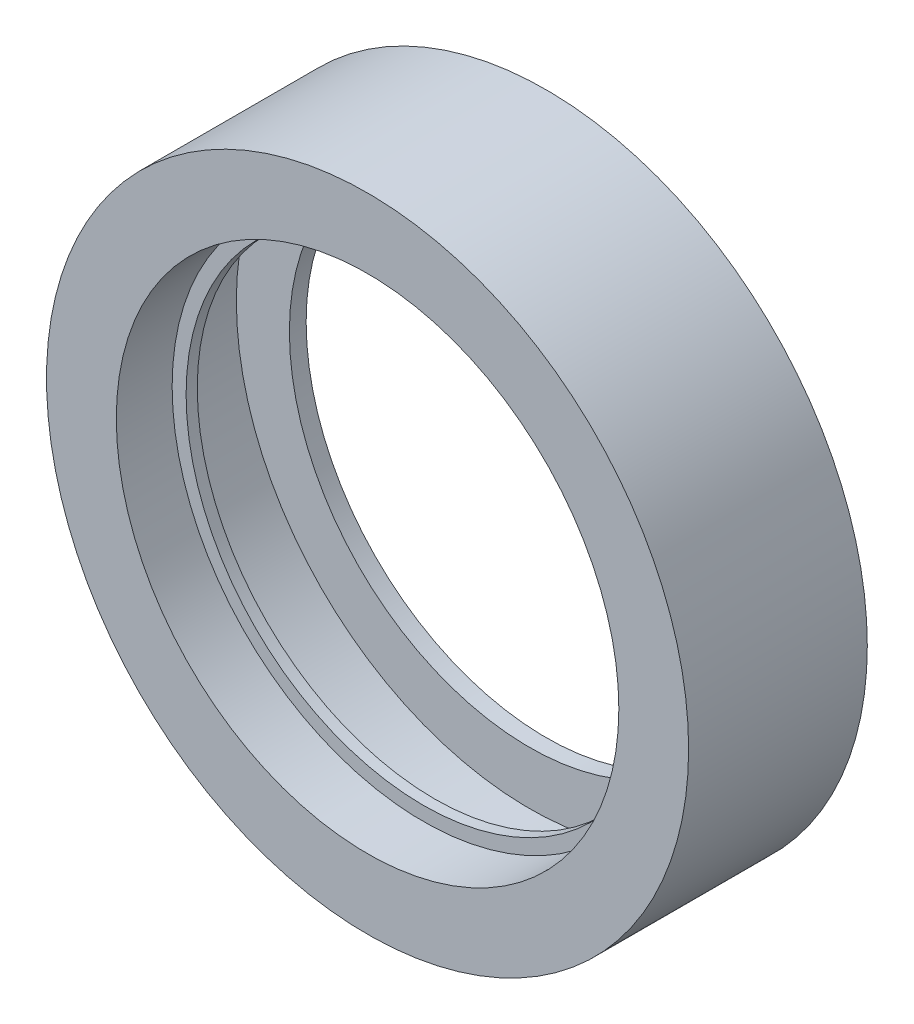
ISO-10303-21;
HEADER;
FILE_DESCRIPTION(('STEP AP214'),'2;1');
FILE_NAME('part.step','',(''),(''),'','','');
FILE_SCHEMA(('AUTOMOTIVE_DESIGN { 1 0 10303 214 1 1 1 1 }'));
ENDSEC;
DATA;
#1=APPLICATION_CONTEXT('core data for automotive mechanical design processes');
#2=APPLICATION_PROTOCOL_DEFINITION('international standard','automotive_design',2000,#1);
#3=PRODUCT_CONTEXT('',#1,'mechanical');
#4=PRODUCT('Part','Part','',(#3));
#5=PRODUCT_RELATED_PRODUCT_CATEGORY('part','',(#4));
#6=PRODUCT_DEFINITION_FORMATION('','',#4);
#7=PRODUCT_DEFINITION_CONTEXT('part definition',#1,'design');
#8=PRODUCT_DEFINITION('design','',#6,#7);
#9=PRODUCT_DEFINITION_SHAPE('','',#8);
#10=(LENGTH_UNIT() NAMED_UNIT(*) SI_UNIT(.MILLI.,.METRE.));
#11=(NAMED_UNIT(*) PLANE_ANGLE_UNIT() SI_UNIT($,.RADIAN.));
#12=(NAMED_UNIT(*) SI_UNIT($,.STERADIAN.) SOLID_ANGLE_UNIT());
#13=UNCERTAINTY_MEASURE_WITH_UNIT(LENGTH_MEASURE(1.E-05),#10,'distance_accuracy_value','');
#14=(GEOMETRIC_REPRESENTATION_CONTEXT(3) GLOBAL_UNCERTAINTY_ASSIGNED_CONTEXT((#13)) GLOBAL_UNIT_ASSIGNED_CONTEXT((#10,
#11,#12)) REPRESENTATION_CONTEXT('',''));
#15=CARTESIAN_POINT('',(0.,0.,0.));
#16=DIRECTION('',(0.,0.,1.));
#17=DIRECTION('',(1.,0.,0.));
#18=AXIS2_PLACEMENT_3D('',#15,#16,#17);
#19=CARTESIAN_POINT('',(0.,0.,32.));
#20=DIRECTION('',(0.,0.,-1.));
#21=DIRECTION('',(-1.,0.,0.));
#22=AXIS2_PLACEMENT_3D('',#19,#20,#21);
#23=CYLINDRICAL_SURFACE('',#22,52.5);
#24=CARTESIAN_POINT('',(0.,0.,20.));
#25=DIRECTION('',(0.,0.,1.));
#26=DIRECTION('',(1.,0.,0.));
#27=AXIS2_PLACEMENT_3D('',#24,#25,#26);
#28=CIRCLE('',#27,52.5);
#29=CARTESIAN_POINT('',(52.5,0.,20.));
#30=VERTEX_POINT('',#29);
#31=EDGE_CURVE('E58',#30,#30,#28,.T.);
#32=ORIENTED_EDGE('',*,*,#31,.T.);
#33=EDGE_LOOP('',(#32));
#34=FACE_BOUND('',#33,.T.);
#35=CARTESIAN_POINT('',(0.,0.,3.));
#36=DIRECTION('',(0.,0.,-1.));
#37=DIRECTION('',(-1.,0.,0.));
#38=AXIS2_PLACEMENT_3D('',#35,#36,#37);
#39=CIRCLE('',#38,52.5);
#40=CARTESIAN_POINT('',(-52.5,0.,3.));
#41=VERTEX_POINT('',#40);
#42=EDGE_CURVE('E72',#41,#41,#39,.T.);
#43=ORIENTED_EDGE('',*,*,#42,.T.);
#44=EDGE_LOOP('',(#43));
#45=FACE_BOUND('',#44,.T.);
#46=ADVANCED_FACE('F39',(#34,#45),#23,.F.);
#47=CARTESIAN_POINT('',(0.,0.,32.));
#48=DIRECTION('',(0.,0.,1.));
#49=DIRECTION('',(1.,0.,0.));
#50=AXIS2_PLACEMENT_3D('',#47,#48,#49);
#51=PLANE('',#50);
#52=CARTESIAN_POINT('',(0.,0.,32.));
#53=DIRECTION('',(0.,0.,1.));
#54=DIRECTION('',(1.,0.,0.));
#55=AXIS2_PLACEMENT_3D('',#52,#53,#54);
#56=CIRCLE('',#55,57.5);
#57=CARTESIAN_POINT('',(57.5,0.,32.));
#58=VERTEX_POINT('',#57);
#59=EDGE_CURVE('E47',#58,#58,#56,.T.);
#60=ORIENTED_EDGE('',*,*,#59,.T.);
#61=EDGE_LOOP('',(#60));
#62=FACE_BOUND('',#61,.T.);
#63=CARTESIAN_POINT('',(0.,0.,32.));
#64=DIRECTION('',(0.,0.,1.));
#65=DIRECTION('',(1.,0.,0.));
#66=AXIS2_PLACEMENT_3D('',#63,#64,#65);
#67=CIRCLE('',#66,45.);
#68=CARTESIAN_POINT('',(45.,0.,32.));
#69=VERTEX_POINT('',#68);
#70=EDGE_CURVE('E60',#69,#69,#67,.T.);
#71=ORIENTED_EDGE('',*,*,#70,.F.);
#72=EDGE_LOOP('',(#71));
#73=FACE_BOUND('',#72,.T.);
#74=ADVANCED_FACE('F99',(#62,#73),#51,.T.);
#75=CARTESIAN_POINT('',(0.,0.,0.));
#76=DIRECTION('',(0.,0.,1.));
#77=DIRECTION('',(1.,0.,0.));
#78=AXIS2_PLACEMENT_3D('',#75,#76,#77);
#79=PLANE('',#78);
#80=CARTESIAN_POINT('',(0.,0.,0.));
#81=DIRECTION('',(0.,0.,1.));
#82=DIRECTION('',(1.,0.,0.));
#83=AXIS2_PLACEMENT_3D('',#80,#81,#82);
#84=CIRCLE('',#83,57.5);
#85=CARTESIAN_POINT('',(57.5,0.,0.));
#86=VERTEX_POINT('',#85);
#87=EDGE_CURVE('E52',#86,#86,#84,.T.);
#88=ORIENTED_EDGE('',*,*,#87,.F.);
#89=EDGE_LOOP('',(#88));
#90=FACE_BOUND('',#89,.T.);
#91=CARTESIAN_POINT('',(0.,0.,0.));
#92=DIRECTION('',(0.,0.,-1.));
#93=DIRECTION('',(-1.,0.,0.));
#94=AXIS2_PLACEMENT_3D('',#91,#92,#93);
#95=CIRCLE('',#94,43.);
#96=CARTESIAN_POINT('',(-43.,0.,0.));
#97=VERTEX_POINT('',#96);
#98=EDGE_CURVE('E80',#97,#97,#95,.T.);
#99=ORIENTED_EDGE('',*,*,#98,.F.);
#100=EDGE_LOOP('',(#99));
#101=FACE_BOUND('',#100,.T.);
#102=ADVANCED_FACE('F97',(#90,#101),#79,.F.);
#103=CARTESIAN_POINT('',(0.,0.,32.));
#104=DIRECTION('',(0.,0.,-1.));
#105=DIRECTION('',(-1.,0.,0.));
#106=AXIS2_PLACEMENT_3D('',#103,#104,#105);
#107=CYLINDRICAL_SURFACE('',#106,57.5);
#108=ORIENTED_EDGE('',*,*,#59,.F.);
#109=EDGE_LOOP('',(#108));
#110=FACE_BOUND('',#109,.T.);
#111=ORIENTED_EDGE('',*,*,#87,.T.);
#112=EDGE_LOOP('',(#111));
#113=FACE_BOUND('',#112,.T.);
#114=ADVANCED_FACE('F41',(#110,#113),#107,.T.);
#115=CARTESIAN_POINT('',(0.,0.,180.492424049175));
#116=DIRECTION('',(0.,0.,-1.));
#117=DIRECTION('',(-1.,0.,0.));
#118=AXIS2_PLACEMENT_3D('',#115,#116,#117);
#119=CYLINDRICAL_SURFACE('',#118,45.);
#120=CARTESIAN_POINT('',(0.,0.,22.));
#121=DIRECTION('',(0.,0.,1.));
#122=DIRECTION('',(1.,0.,0.));
#123=AXIS2_PLACEMENT_3D('',#120,#121,#122);
#124=CIRCLE('',#123,45.);
#125=CARTESIAN_POINT('',(45.,0.,22.));
#126=VERTEX_POINT('',#125);
#127=EDGE_CURVE('E10',#126,#126,#124,.T.);
#128=ORIENTED_EDGE('',*,*,#127,.F.);
#129=EDGE_LOOP('',(#128));
#130=FACE_BOUND('',#129,.T.);
#131=ORIENTED_EDGE('',*,*,#70,.T.);
#132=EDGE_LOOP('',(#131));
#133=FACE_BOUND('',#132,.T.);
#134=ADVANCED_FACE('F105',(#130,#133),#119,.F.);
#135=CARTESIAN_POINT('',(0.,0.,20.));
#136=DIRECTION('',(0.,0.,1.));
#137=DIRECTION('',(1.,0.,0.));
#138=AXIS2_PLACEMENT_3D('',#135,#136,#137);
#139=PLANE('',#138);
#140=ORIENTED_EDGE('',*,*,#31,.F.);
#141=EDGE_LOOP('',(#140));
#142=FACE_BOUND('',#141,.T.);
#143=CARTESIAN_POINT('',(0.,0.,20.));
#144=DIRECTION('',(0.,0.,1.));
#145=DIRECTION('',(1.,0.,0.));
#146=AXIS2_PLACEMENT_3D('',#143,#144,#145);
#147=CIRCLE('',#146,42.5);
#148=CARTESIAN_POINT('',(42.5,0.,20.));
#149=VERTEX_POINT('',#148);
#150=EDGE_CURVE('E68',#149,#149,#147,.T.);
#151=ORIENTED_EDGE('',*,*,#150,.T.);
#152=EDGE_LOOP('',(#151));
#153=FACE_BOUND('',#152,.T.);
#154=ADVANCED_FACE('F118',(#142,#153),#139,.F.);
#155=CARTESIAN_POINT('',(0.,0.,22.));
#156=DIRECTION('',(0.,0.,-1.));
#157=DIRECTION('',(-1.,0.,0.));
#158=AXIS2_PLACEMENT_3D('',#155,#156,#157);
#159=CYLINDRICAL_SURFACE('',#158,42.5);
#160=CARTESIAN_POINT('',(0.,0.,22.));
#161=DIRECTION('',(0.,0.,1.));
#162=DIRECTION('',(1.,0.,0.));
#163=AXIS2_PLACEMENT_3D('',#160,#161,#162);
#164=CIRCLE('',#163,42.5);
#165=CARTESIAN_POINT('',(42.5,0.,22.));
#166=VERTEX_POINT('',#165);
#167=EDGE_CURVE('E64',#166,#166,#164,.T.);
#168=ORIENTED_EDGE('',*,*,#167,.T.);
#169=EDGE_LOOP('',(#168));
#170=FACE_BOUND('',#169,.T.);
#171=ORIENTED_EDGE('',*,*,#150,.F.);
#172=EDGE_LOOP('',(#171));
#173=FACE_BOUND('',#172,.T.);
#174=ADVANCED_FACE('F122',(#170,#173),#159,.F.);
#175=CARTESIAN_POINT('',(0.,0.,22.));
#176=DIRECTION('',(0.,0.,1.));
#177=DIRECTION('',(1.,0.,0.));
#178=AXIS2_PLACEMENT_3D('',#175,#176,#177);
#179=PLANE('',#178);
#180=ORIENTED_EDGE('',*,*,#167,.F.);
#181=EDGE_LOOP('',(#180));
#182=FACE_BOUND('',#181,.T.);
#183=ORIENTED_EDGE('',*,*,#127,.T.);
#184=EDGE_LOOP('',(#183));
#185=FACE_BOUND('',#184,.T.);
#186=ADVANCED_FACE('F126',(#182,#185),#179,.T.);
#187=CARTESIAN_POINT('',(0.,0.,3.));
#188=DIRECTION('',(0.,0.,-1.));
#189=DIRECTION('',(-1.,0.,0.));
#190=AXIS2_PLACEMENT_3D('',#187,#188,#189);
#191=PLANE('',#190);
#192=CARTESIAN_POINT('',(0.,0.,3.));
#193=DIRECTION('',(0.,0.,-1.));
#194=DIRECTION('',(-1.,0.,0.));
#195=AXIS2_PLACEMENT_3D('',#192,#193,#194);
#196=CIRCLE('',#195,43.);
#197=CARTESIAN_POINT('',(-43.,0.,3.));
#198=VERTEX_POINT('',#197);
#199=EDGE_CURVE('E79',#198,#198,#196,.T.);
#200=ORIENTED_EDGE('',*,*,#199,.T.);
#201=EDGE_LOOP('',(#200));
#202=FACE_BOUND('',#201,.T.);
#203=ORIENTED_EDGE('',*,*,#42,.F.);
#204=EDGE_LOOP('',(#203));
#205=FACE_BOUND('',#204,.T.);
#206=ADVANCED_FACE('F88',(#202,#205),#191,.F.);
#207=CARTESIAN_POINT('',(0.,0.,3.));
#208=DIRECTION('',(0.,0.,-1.));
#209=DIRECTION('',(-1.,0.,0.));
#210=AXIS2_PLACEMENT_3D('',#207,#208,#209);
#211=CYLINDRICAL_SURFACE('',#210,43.);
#212=ORIENTED_EDGE('',*,*,#199,.F.);
#213=EDGE_LOOP('',(#212));
#214=FACE_BOUND('',#213,.T.);
#215=ORIENTED_EDGE('',*,*,#98,.T.);
#216=EDGE_LOOP('',(#215));
#217=FACE_BOUND('',#216,.T.);
#218=ADVANCED_FACE('F91',(#214,#217),#211,.F.);
#219=CLOSED_SHELL('',(#46,#74,#102,#114,#134,#154,#174,#186,#206,#218));
#220=MANIFOLD_SOLID_BREP('B2',#219);
#221=ADVANCED_BREP_SHAPE_REPRESENTATION('',(#18,#220),#14);
#222=SHAPE_DEFINITION_REPRESENTATION(#9,#221);
ENDSEC;
END-ISO-10303-21;
